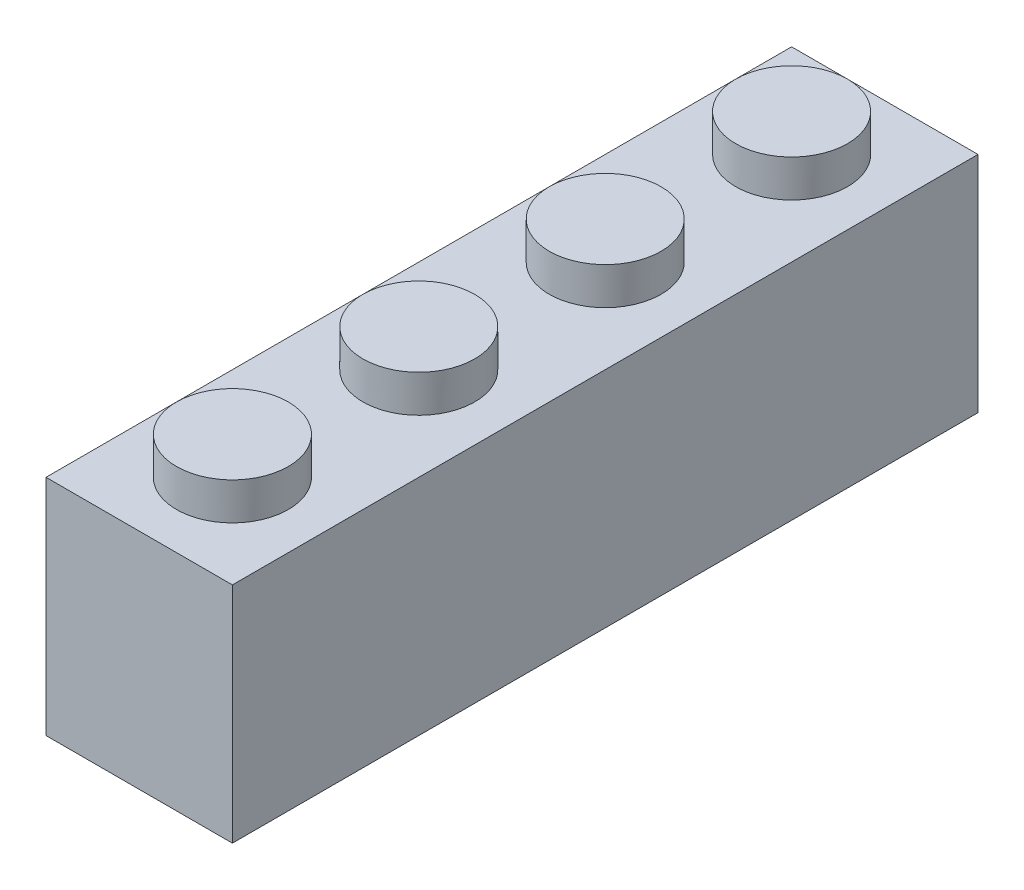
ISO-10303-21;
HEADER;
FILE_DESCRIPTION(('STEP AP214'),'2;1');
FILE_NAME('part.step','',(''),(''),'','','');
FILE_SCHEMA(('AUTOMOTIVE_DESIGN { 1 0 10303 214 1 1 1 1 }'));
ENDSEC;
DATA;
#1=APPLICATION_CONTEXT('core data for automotive mechanical design processes');
#2=APPLICATION_PROTOCOL_DEFINITION('international standard','automotive_design',2000,#1);
#3=PRODUCT_CONTEXT('',#1,'mechanical');
#4=PRODUCT('Part','Part','',(#3));
#5=PRODUCT_RELATED_PRODUCT_CATEGORY('part','',(#4));
#6=PRODUCT_DEFINITION_FORMATION('','',#4);
#7=PRODUCT_DEFINITION_CONTEXT('part definition',#1,'design');
#8=PRODUCT_DEFINITION('design','',#6,#7);
#9=PRODUCT_DEFINITION_SHAPE('','',#8);
#10=(LENGTH_UNIT() NAMED_UNIT(*) SI_UNIT(.MILLI.,.METRE.));
#11=(NAMED_UNIT(*) PLANE_ANGLE_UNIT() SI_UNIT($,.RADIAN.));
#12=(NAMED_UNIT(*) SI_UNIT($,.STERADIAN.) SOLID_ANGLE_UNIT());
#13=UNCERTAINTY_MEASURE_WITH_UNIT(LENGTH_MEASURE(1.E-05),#10,'distance_accuracy_value','');
#14=(GEOMETRIC_REPRESENTATION_CONTEXT(3) GLOBAL_UNCERTAINTY_ASSIGNED_CONTEXT((#13)) GLOBAL_UNIT_ASSIGNED_CONTEXT((#10,
#11,#12)) REPRESENTATION_CONTEXT('',''));
#15=CARTESIAN_POINT('',(0.,0.,0.));
#16=DIRECTION('',(0.,0.,1.));
#17=DIRECTION('',(1.,0.,0.));
#18=AXIS2_PLACEMENT_3D('',#15,#16,#17);
#19=CARTESIAN_POINT('',(0.,0.,0.));
#20=DIRECTION('',(0.,-1.,0.));
#21=DIRECTION('',(0.,0.,-1.));
#22=AXIS2_PLACEMENT_3D('',#19,#20,#21);
#23=PLANE('',#22);
#24=DIRECTION('',(0.,0.,1.));
#25=VECTOR('',#24,1.);
#26=CARTESIAN_POINT('',(0.,0.,0.));
#27=LINE('',#26,#25);
#28=CARTESIAN_POINT('',(0.,0.,-32.));
#29=VERTEX_POINT('',#28);
#30=CARTESIAN_POINT('',(0.,0.,0.));
#31=VERTEX_POINT('',#30);
#32=EDGE_CURVE('E172',#29,#31,#27,.T.);
#33=ORIENTED_EDGE('',*,*,#32,.F.);
#34=DIRECTION('',(-1.,0.,0.));
#35=VECTOR('',#34,1.);
#36=CARTESIAN_POINT('',(0.,0.,-32.));
#37=LINE('',#36,#35);
#38=CARTESIAN_POINT('',(8.,0.,-32.));
#39=VERTEX_POINT('',#38);
#40=EDGE_CURVE('E82',#39,#29,#37,.T.);
#41=ORIENTED_EDGE('',*,*,#40,.F.);
#42=DIRECTION('',(0.,0.,-1.));
#43=VECTOR('',#42,1.);
#44=CARTESIAN_POINT('',(8.,0.,0.));
#45=LINE('',#44,#43);
#46=CARTESIAN_POINT('',(8.,0.,0.));
#47=VERTEX_POINT('',#46);
#48=EDGE_CURVE('E184',#47,#39,#45,.T.);
#49=ORIENTED_EDGE('',*,*,#48,.F.);
#50=DIRECTION('',(1.,0.,0.));
#51=VECTOR('',#50,1.);
#52=CARTESIAN_POINT('',(0.,0.,0.));
#53=LINE('',#52,#51);
#54=EDGE_CURVE('E182',#31,#47,#53,.T.);
#55=ORIENTED_EDGE('',*,*,#54,.F.);
#56=EDGE_LOOP('',(#33,#41,#49,#55));
#57=FACE_BOUND('',#56,.T.);
#58=DIRECTION('',(-1.,0.,0.));
#59=VECTOR('',#58,1.);
#60=CARTESIAN_POINT('',(0.,0.,-30.4));
#61=LINE('',#60,#59);
#62=CARTESIAN_POINT('',(6.4,0.,-30.4));
#63=VERTEX_POINT('',#62);
#64=CARTESIAN_POINT('',(1.6,0.,-30.4));
#65=VERTEX_POINT('',#64);
#66=EDGE_CURVE('E160',#63,#65,#61,.T.);
#67=ORIENTED_EDGE('',*,*,#66,.T.);
#68=DIRECTION('',(0.,0.,1.));
#69=VECTOR('',#68,1.);
#70=CARTESIAN_POINT('',(1.6,0.,0.));
#71=LINE('',#70,#69);
#72=CARTESIAN_POINT('',(1.6,0.,-1.6));
#73=VERTEX_POINT('',#72);
#74=EDGE_CURVE('E153',#65,#73,#71,.T.);
#75=ORIENTED_EDGE('',*,*,#74,.T.);
#76=DIRECTION('',(1.,0.,0.));
#77=VECTOR('',#76,1.);
#78=CARTESIAN_POINT('',(0.,0.,-1.6));
#79=LINE('',#78,#77);
#80=CARTESIAN_POINT('',(6.4,0.,-1.6));
#81=VERTEX_POINT('',#80);
#82=EDGE_CURVE('E159',#73,#81,#79,.T.);
#83=ORIENTED_EDGE('',*,*,#82,.T.);
#84=DIRECTION('',(0.,0.,-1.));
#85=VECTOR('',#84,1.);
#86=CARTESIAN_POINT('',(6.4,0.,0.));
#87=LINE('',#86,#85);
#88=EDGE_CURVE('E52',#81,#63,#87,.T.);
#89=ORIENTED_EDGE('',*,*,#88,.T.);
#90=EDGE_LOOP('',(#67,#75,#83,#89));
#91=FACE_BOUND('',#90,.T.);
#92=ADVANCED_FACE('F37',(#57,#91),#23,.T.);
#93=CARTESIAN_POINT('',(4.,11.2,-28.));
#94=DIRECTION('',(0.,1.,0.));
#95=DIRECTION('',(0.,0.,1.));
#96=AXIS2_PLACEMENT_3D('',#93,#94,#95);
#97=PLANE('',#96);
#98=CARTESIAN_POINT('',(4.,11.2,-28.));
#99=DIRECTION('',(0.,1.,0.));
#100=DIRECTION('',(0.,0.,1.));
#101=AXIS2_PLACEMENT_3D('',#98,#99,#100);
#102=CIRCLE('',#101,2.4);
#103=CARTESIAN_POINT('',(4.,11.2,-25.6));
#104=VERTEX_POINT('',#103);
#105=EDGE_CURVE('E11',#104,#104,#102,.T.);
#106=ORIENTED_EDGE('',*,*,#105,.T.);
#107=EDGE_LOOP('',(#106));
#108=FACE_BOUND('',#107,.T.);
#109=ADVANCED_FACE('F39',(#108),#97,.T.);
#110=CARTESIAN_POINT('',(4.,11.2,-28.));
#111=DIRECTION('',(0.,-1.,0.));
#112=DIRECTION('',(0.,0.,-1.));
#113=AXIS2_PLACEMENT_3D('',#110,#111,#112);
#114=CYLINDRICAL_SURFACE('',#113,2.4);
#115=ORIENTED_EDGE('',*,*,#105,.F.);
#116=EDGE_LOOP('',(#115));
#117=FACE_BOUND('',#116,.T.);
#118=CARTESIAN_POINT('',(4.,9.6,-28.));
#119=DIRECTION('',(0.,-1.,0.));
#120=DIRECTION('',(0.,0.,-1.));
#121=AXIS2_PLACEMENT_3D('',#118,#119,#120);
#122=CIRCLE('',#121,2.4);
#123=CARTESIAN_POINT('',(4.,9.6,-30.4));
#124=VERTEX_POINT('',#123);
#125=EDGE_CURVE('E45',#124,#124,#122,.F.);
#126=ORIENTED_EDGE('',*,*,#125,.T.);
#127=EDGE_LOOP('',(#126));
#128=FACE_BOUND('',#127,.T.);
#129=ADVANCED_FACE('F209',(#117,#128),#114,.T.);
#130=CARTESIAN_POINT('',(4.,11.2,-20.));
#131=DIRECTION('',(0.,1.,0.));
#132=DIRECTION('',(0.,0.,1.));
#133=AXIS2_PLACEMENT_3D('',#130,#131,#132);
#134=PLANE('',#133);
#135=CARTESIAN_POINT('',(4.,11.2,-20.));
#136=DIRECTION('',(0.,1.,0.));
#137=DIRECTION('',(0.,0.,1.));
#138=AXIS2_PLACEMENT_3D('',#135,#136,#137);
#139=CIRCLE('',#138,2.4);
#140=CARTESIAN_POINT('',(4.,11.2,-17.6));
#141=VERTEX_POINT('',#140);
#142=EDGE_CURVE('E204',#141,#141,#139,.T.);
#143=ORIENTED_EDGE('',*,*,#142,.T.);
#144=EDGE_LOOP('',(#143));
#145=FACE_BOUND('',#144,.T.);
#146=ADVANCED_FACE('F251',(#145),#134,.T.);
#147=CARTESIAN_POINT('',(4.,11.2,-20.));
#148=DIRECTION('',(0.,-1.,0.));
#149=DIRECTION('',(0.,0.,-1.));
#150=AXIS2_PLACEMENT_3D('',#147,#148,#149);
#151=CYLINDRICAL_SURFACE('',#150,2.4);
#152=ORIENTED_EDGE('',*,*,#142,.F.);
#153=EDGE_LOOP('',(#152));
#154=FACE_BOUND('',#153,.T.);
#155=CARTESIAN_POINT('',(4.,9.6,-20.));
#156=DIRECTION('',(0.,-1.,0.));
#157=DIRECTION('',(0.,0.,-1.));
#158=AXIS2_PLACEMENT_3D('',#155,#156,#157);
#159=CIRCLE('',#158,2.4);
#160=CARTESIAN_POINT('',(4.,9.6,-22.4));
#161=VERTEX_POINT('',#160);
#162=EDGE_CURVE('E201',#161,#161,#159,.F.);
#163=ORIENTED_EDGE('',*,*,#162,.T.);
#164=EDGE_LOOP('',(#163));
#165=FACE_BOUND('',#164,.T.);
#166=ADVANCED_FACE('F247',(#154,#165),#151,.T.);
#167=CARTESIAN_POINT('',(0.,9.6,0.));
#168=DIRECTION('',(1.,0.,0.));
#169=DIRECTION('',(0.,0.,-1.));
#170=AXIS2_PLACEMENT_3D('',#167,#168,#169);
#171=PLANE('',#170);
#172=ORIENTED_EDGE('',*,*,#32,.T.);
#173=DIRECTION('',(0.,-1.,0.));
#174=VECTOR('',#173,1.);
#175=CARTESIAN_POINT('',(0.,9.6,0.));
#176=LINE('',#175,#174);
#177=CARTESIAN_POINT('',(0.,9.6,0.));
#178=VERTEX_POINT('',#177);
#179=EDGE_CURVE('E193',#178,#31,#176,.T.);
#180=ORIENTED_EDGE('',*,*,#179,.F.);
#181=DIRECTION('',(0.,0.,1.));
#182=VECTOR('',#181,1.);
#183=CARTESIAN_POINT('',(0.,9.6,0.));
#184=LINE('',#183,#182);
#185=CARTESIAN_POINT('',(0.,9.6,-32.));
#186=VERTEX_POINT('',#185);
#187=EDGE_CURVE('E173',#186,#178,#184,.T.);
#188=ORIENTED_EDGE('',*,*,#187,.F.);
#189=DIRECTION('',(0.,-1.,0.));
#190=VECTOR('',#189,1.);
#191=CARTESIAN_POINT('',(0.,9.6,-32.));
#192=LINE('',#191,#190);
#193=EDGE_CURVE('E179',#186,#29,#192,.T.);
#194=ORIENTED_EDGE('',*,*,#193,.T.);
#195=EDGE_LOOP('',(#172,#180,#188,#194));
#196=FACE_BOUND('',#195,.T.);
#197=ADVANCED_FACE('F244',(#196),#171,.F.);
#198=CARTESIAN_POINT('',(0.,9.6,0.));
#199=DIRECTION('',(0.,0.,-1.));
#200=DIRECTION('',(-1.,0.,0.));
#201=AXIS2_PLACEMENT_3D('',#198,#199,#200);
#202=PLANE('',#201);
#203=ORIENTED_EDGE('',*,*,#54,.T.);
#204=DIRECTION('',(0.,-1.,0.));
#205=VECTOR('',#204,1.);
#206=CARTESIAN_POINT('',(8.,9.6,0.));
#207=LINE('',#206,#205);
#208=CARTESIAN_POINT('',(8.,9.6,0.));
#209=VERTEX_POINT('',#208);
#210=EDGE_CURVE('E190',#209,#47,#207,.T.);
#211=ORIENTED_EDGE('',*,*,#210,.F.);
#212=DIRECTION('',(1.,0.,0.));
#213=VECTOR('',#212,1.);
#214=CARTESIAN_POINT('',(0.,9.6,0.));
#215=LINE('',#214,#213);
#216=EDGE_CURVE('E90',#178,#209,#215,.T.);
#217=ORIENTED_EDGE('',*,*,#216,.F.);
#218=ORIENTED_EDGE('',*,*,#179,.T.);
#219=EDGE_LOOP('',(#203,#211,#217,#218));
#220=FACE_BOUND('',#219,.T.);
#221=ADVANCED_FACE('F240',(#220),#202,.F.);
#222=CARTESIAN_POINT('',(8.,9.6,0.));
#223=DIRECTION('',(-1.,0.,0.));
#224=DIRECTION('',(0.,0.,1.));
#225=AXIS2_PLACEMENT_3D('',#222,#223,#224);
#226=PLANE('',#225);
#227=ORIENTED_EDGE('',*,*,#48,.T.);
#228=DIRECTION('',(0.,-1.,0.));
#229=VECTOR('',#228,1.);
#230=CARTESIAN_POINT('',(8.,9.6,-32.));
#231=LINE('',#230,#229);
#232=CARTESIAN_POINT('',(8.,9.6,-32.));
#233=VERTEX_POINT('',#232);
#234=EDGE_CURVE('E188',#233,#39,#231,.T.);
#235=ORIENTED_EDGE('',*,*,#234,.F.);
#236=DIRECTION('',(0.,0.,-1.));
#237=VECTOR('',#236,1.);
#238=CARTESIAN_POINT('',(8.,9.6,0.));
#239=LINE('',#238,#237);
#240=EDGE_CURVE('E176',#209,#233,#239,.T.);
#241=ORIENTED_EDGE('',*,*,#240,.F.);
#242=ORIENTED_EDGE('',*,*,#210,.T.);
#243=EDGE_LOOP('',(#227,#235,#241,#242));
#244=FACE_BOUND('',#243,.T.);
#245=ADVANCED_FACE('F224',(#244),#226,.F.);
#246=CARTESIAN_POINT('',(0.,9.6,-32.));
#247=DIRECTION('',(0.,0.,1.));
#248=DIRECTION('',(1.,0.,0.));
#249=AXIS2_PLACEMENT_3D('',#246,#247,#248);
#250=PLANE('',#249);
#251=ORIENTED_EDGE('',*,*,#40,.T.);
#252=ORIENTED_EDGE('',*,*,#193,.F.);
#253=DIRECTION('',(-1.,0.,0.));
#254=VECTOR('',#253,1.);
#255=CARTESIAN_POINT('',(0.,9.6,-32.));
#256=LINE('',#255,#254);
#257=EDGE_CURVE('E61',#233,#186,#256,.T.);
#258=ORIENTED_EDGE('',*,*,#257,.F.);
#259=ORIENTED_EDGE('',*,*,#234,.T.);
#260=EDGE_LOOP('',(#251,#252,#258,#259));
#261=FACE_BOUND('',#260,.T.);
#262=ADVANCED_FACE('F214',(#261),#250,.F.);
#263=CARTESIAN_POINT('',(0.,9.6,0.));
#264=DIRECTION('',(0.,-1.,0.));
#265=DIRECTION('',(0.,0.,-1.));
#266=AXIS2_PLACEMENT_3D('',#263,#264,#265);
#267=PLANE('',#266);
#268=CARTESIAN_POINT('',(4.,9.6,-12.));
#269=DIRECTION('',(0.,-1.,0.));
#270=DIRECTION('',(0.,0.,-1.));
#271=AXIS2_PLACEMENT_3D('',#268,#269,#270);
#272=CIRCLE('',#271,2.4);
#273=CARTESIAN_POINT('',(4.,9.6,-14.4));
#274=VERTEX_POINT('',#273);
#275=EDGE_CURVE('E198',#274,#274,#272,.F.);
#276=ORIENTED_EDGE('',*,*,#275,.F.);
#277=EDGE_LOOP('',(#276));
#278=FACE_BOUND('',#277,.T.);
#279=CARTESIAN_POINT('',(4.,9.6,-4.));
#280=DIRECTION('',(0.,-1.,0.));
#281=DIRECTION('',(0.,0.,-1.));
#282=AXIS2_PLACEMENT_3D('',#279,#280,#281);
#283=CIRCLE('',#282,2.4);
#284=CARTESIAN_POINT('',(4.,9.6,-6.4));
#285=VERTEX_POINT('',#284);
#286=EDGE_CURVE('E195',#285,#285,#283,.F.);
#287=ORIENTED_EDGE('',*,*,#286,.F.);
#288=EDGE_LOOP('',(#287));
#289=FACE_BOUND('',#288,.T.);
#290=ORIENTED_EDGE('',*,*,#187,.T.);
#291=ORIENTED_EDGE('',*,*,#216,.T.);
#292=ORIENTED_EDGE('',*,*,#240,.T.);
#293=ORIENTED_EDGE('',*,*,#257,.T.);
#294=EDGE_LOOP('',(#290,#291,#292,#293));
#295=FACE_BOUND('',#294,.T.);
#296=ORIENTED_EDGE('',*,*,#162,.F.);
#297=EDGE_LOOP('',(#296));
#298=FACE_BOUND('',#297,.T.);
#299=ORIENTED_EDGE('',*,*,#125,.F.);
#300=EDGE_LOOP('',(#299));
#301=FACE_BOUND('',#300,.T.);
#302=ADVANCED_FACE('F211',(#278,#289,#295,#298,#301),#267,.F.);
#303=CARTESIAN_POINT('',(4.,11.2,-4.));
#304=DIRECTION('',(0.,-1.,0.));
#305=DIRECTION('',(0.,0.,-1.));
#306=AXIS2_PLACEMENT_3D('',#303,#304,#305);
#307=CYLINDRICAL_SURFACE('',#306,2.4);
#308=CARTESIAN_POINT('',(4.,11.2,-4.));
#309=DIRECTION('',(0.,1.,0.));
#310=DIRECTION('',(0.,0.,1.));
#311=AXIS2_PLACEMENT_3D('',#308,#309,#310);
#312=CIRCLE('',#311,2.4);
#313=CARTESIAN_POINT('',(4.,11.2,-1.6));
#314=VERTEX_POINT('',#313);
#315=EDGE_CURVE('E168',#314,#314,#312,.T.);
#316=ORIENTED_EDGE('',*,*,#315,.F.);
#317=EDGE_LOOP('',(#316));
#318=FACE_BOUND('',#317,.T.);
#319=ORIENTED_EDGE('',*,*,#286,.T.);
#320=EDGE_LOOP('',(#319));
#321=FACE_BOUND('',#320,.T.);
#322=ADVANCED_FACE('F213',(#318,#321),#307,.T.);
#323=CARTESIAN_POINT('',(4.,11.2,-4.));
#324=DIRECTION('',(0.,1.,0.));
#325=DIRECTION('',(0.,0.,1.));
#326=AXIS2_PLACEMENT_3D('',#323,#324,#325);
#327=PLANE('',#326);
#328=ORIENTED_EDGE('',*,*,#315,.T.);
#329=EDGE_LOOP('',(#328));
#330=FACE_BOUND('',#329,.T.);
#331=ADVANCED_FACE('F221',(#330),#327,.T.);
#332=CARTESIAN_POINT('',(4.,11.2,-12.));
#333=DIRECTION('',(0.,-1.,0.));
#334=DIRECTION('',(0.,0.,-1.));
#335=AXIS2_PLACEMENT_3D('',#332,#333,#334);
#336=CYLINDRICAL_SURFACE('',#335,2.4);
#337=CARTESIAN_POINT('',(4.,11.2,-12.));
#338=DIRECTION('',(0.,1.,0.));
#339=DIRECTION('',(0.,0.,1.));
#340=AXIS2_PLACEMENT_3D('',#337,#338,#339);
#341=CIRCLE('',#340,2.4);
#342=CARTESIAN_POINT('',(4.,11.2,-9.6));
#343=VERTEX_POINT('',#342);
#344=EDGE_CURVE('E165',#343,#343,#341,.T.);
#345=ORIENTED_EDGE('',*,*,#344,.F.);
#346=EDGE_LOOP('',(#345));
#347=FACE_BOUND('',#346,.T.);
#348=ORIENTED_EDGE('',*,*,#275,.T.);
#349=EDGE_LOOP('',(#348));
#350=FACE_BOUND('',#349,.T.);
#351=ADVANCED_FACE('F301',(#347,#350),#336,.T.);
#352=CARTESIAN_POINT('',(4.,11.2,-12.));
#353=DIRECTION('',(0.,1.,0.));
#354=DIRECTION('',(0.,0.,1.));
#355=AXIS2_PLACEMENT_3D('',#352,#353,#354);
#356=PLANE('',#355);
#357=ORIENTED_EDGE('',*,*,#344,.T.);
#358=EDGE_LOOP('',(#357));
#359=FACE_BOUND('',#358,.T.);
#360=ADVANCED_FACE('F323',(#359),#356,.T.);
#361=CARTESIAN_POINT('',(4.,9.6,-28.));
#362=DIRECTION('',(0.,1.,0.));
#363=DIRECTION('',(0.,0.,1.));
#364=AXIS2_PLACEMENT_3D('',#361,#362,#363);
#365=PLANE('',#364);
#366=CARTESIAN_POINT('',(4.,9.6,-28.));
#367=DIRECTION('',(0.,1.,0.));
#368=DIRECTION('',(0.,0.,1.));
#369=AXIS2_PLACEMENT_3D('',#366,#367,#368);
#370=CIRCLE('',#369,0.799999999999999);
#371=CARTESIAN_POINT('',(4.,9.6,-27.2));
#372=VERTEX_POINT('',#371);
#373=EDGE_CURVE('E169',#372,#372,#370,.T.);
#374=ORIENTED_EDGE('',*,*,#373,.F.);
#375=EDGE_LOOP('',(#374));
#376=FACE_BOUND('',#375,.T.);
#377=ADVANCED_FACE('F332',(#376),#365,.F.);
#378=CARTESIAN_POINT('',(4.,11.2,-28.));
#379=DIRECTION('',(0.,-1.,0.));
#380=DIRECTION('',(0.,0.,-1.));
#381=AXIS2_PLACEMENT_3D('',#378,#379,#380);
#382=CYLINDRICAL_SURFACE('',#381,0.799999999999999);
#383=ORIENTED_EDGE('',*,*,#373,.T.);
#384=EDGE_LOOP('',(#383));
#385=FACE_BOUND('',#384,.T.);
#386=CARTESIAN_POINT('',(4.,8.,-28.));
#387=DIRECTION('',(0.,-1.,0.));
#388=DIRECTION('',(0.,0.,-1.));
#389=AXIS2_PLACEMENT_3D('',#386,#387,#388);
#390=CIRCLE('',#389,0.799999999999999);
#391=CARTESIAN_POINT('',(4.,8.,-28.8));
#392=VERTEX_POINT('',#391);
#393=EDGE_CURVE('E145',#392,#392,#390,.F.);
#394=ORIENTED_EDGE('',*,*,#393,.F.);
#395=EDGE_LOOP('',(#394));
#396=FACE_BOUND('',#395,.T.);
#397=ADVANCED_FACE('F345',(#385,#396),#382,.F.);
#398=CARTESIAN_POINT('',(4.,9.6,-20.));
#399=DIRECTION('',(0.,1.,0.));
#400=DIRECTION('',(0.,0.,1.));
#401=AXIS2_PLACEMENT_3D('',#398,#399,#400);
#402=PLANE('',#401);
#403=CARTESIAN_POINT('',(4.,9.6,-20.));
#404=DIRECTION('',(0.,1.,0.));
#405=DIRECTION('',(0.,0.,1.));
#406=AXIS2_PLACEMENT_3D('',#403,#404,#405);
#407=CIRCLE('',#406,0.799999999999999);
#408=CARTESIAN_POINT('',(4.,9.6,-19.2));
#409=VERTEX_POINT('',#408);
#410=EDGE_CURVE('E141',#409,#409,#407,.T.);
#411=ORIENTED_EDGE('',*,*,#410,.F.);
#412=EDGE_LOOP('',(#411));
#413=FACE_BOUND('',#412,.T.);
#414=ADVANCED_FACE('F354',(#413),#402,.F.);
#415=CARTESIAN_POINT('',(4.,11.2,-20.));
#416=DIRECTION('',(0.,-1.,0.));
#417=DIRECTION('',(0.,0.,-1.));
#418=AXIS2_PLACEMENT_3D('',#415,#416,#417);
#419=CYLINDRICAL_SURFACE('',#418,0.799999999999999);
#420=ORIENTED_EDGE('',*,*,#410,.T.);
#421=EDGE_LOOP('',(#420));
#422=FACE_BOUND('',#421,.T.);
#423=CARTESIAN_POINT('',(4.,8.,-20.));
#424=DIRECTION('',(0.,-1.,0.));
#425=DIRECTION('',(0.,0.,-1.));
#426=AXIS2_PLACEMENT_3D('',#423,#424,#425);
#427=CIRCLE('',#426,0.799999999999999);
#428=CARTESIAN_POINT('',(4.,8.,-20.8));
#429=VERTEX_POINT('',#428);
#430=EDGE_CURVE('E138',#429,#429,#427,.F.);
#431=ORIENTED_EDGE('',*,*,#430,.F.);
#432=EDGE_LOOP('',(#431));
#433=FACE_BOUND('',#432,.T.);
#434=ADVANCED_FACE('F363',(#422,#433),#419,.F.);
#435=CARTESIAN_POINT('',(1.6,9.6,0.));
#436=DIRECTION('',(1.,0.,0.));
#437=DIRECTION('',(0.,0.,-1.));
#438=AXIS2_PLACEMENT_3D('',#435,#436,#437);
#439=PLANE('',#438);
#440=ORIENTED_EDGE('',*,*,#74,.F.);
#441=DIRECTION('',(0.,-1.,0.));
#442=VECTOR('',#441,1.);
#443=CARTESIAN_POINT('',(1.6,9.6,-30.4));
#444=LINE('',#443,#442);
#445=CARTESIAN_POINT('',(1.6,8.,-30.4));
#446=VERTEX_POINT('',#445);
#447=EDGE_CURVE('E134',#446,#65,#444,.T.);
#448=ORIENTED_EDGE('',*,*,#447,.F.);
#449=DIRECTION('',(0.,0.,1.));
#450=VECTOR('',#449,1.);
#451=CARTESIAN_POINT('',(1.6,8.,0.));
#452=LINE('',#451,#450);
#453=CARTESIAN_POINT('',(1.6,8.,-1.6));
#454=VERTEX_POINT('',#453);
#455=EDGE_CURVE('E123',#446,#454,#452,.T.);
#456=ORIENTED_EDGE('',*,*,#455,.T.);
#457=DIRECTION('',(0.,-1.,0.));
#458=VECTOR('',#457,1.);
#459=CARTESIAN_POINT('',(1.6,9.6,-1.6));
#460=LINE('',#459,#458);
#461=EDGE_CURVE('E117',#454,#73,#460,.T.);
#462=ORIENTED_EDGE('',*,*,#461,.T.);
#463=EDGE_LOOP('',(#440,#448,#456,#462));
#464=FACE_BOUND('',#463,.T.);
#465=ADVANCED_FACE('F372',(#464),#439,.T.);
#466=CARTESIAN_POINT('',(0.,9.6,-1.6));
#467=DIRECTION('',(0.,0.,-1.));
#468=DIRECTION('',(-1.,0.,0.));
#469=AXIS2_PLACEMENT_3D('',#466,#467,#468);
#470=PLANE('',#469);
#471=ORIENTED_EDGE('',*,*,#82,.F.);
#472=ORIENTED_EDGE('',*,*,#461,.F.);
#473=DIRECTION('',(1.,0.,0.));
#474=VECTOR('',#473,1.);
#475=CARTESIAN_POINT('',(0.,8.,-1.6));
#476=LINE('',#475,#474);
#477=CARTESIAN_POINT('',(6.4,8.,-1.6));
#478=VERTEX_POINT('',#477);
#479=EDGE_CURVE('E112',#454,#478,#476,.T.);
#480=ORIENTED_EDGE('',*,*,#479,.T.);
#481=DIRECTION('',(0.,-1.,0.));
#482=VECTOR('',#481,1.);
#483=CARTESIAN_POINT('',(6.4,9.6,-1.6));
#484=LINE('',#483,#482);
#485=EDGE_CURVE('E114',#478,#81,#484,.T.);
#486=ORIENTED_EDGE('',*,*,#485,.T.);
#487=EDGE_LOOP('',(#471,#472,#480,#486));
#488=FACE_BOUND('',#487,.T.);
#489=ADVANCED_FACE('F113',(#488),#470,.T.);
#490=CARTESIAN_POINT('',(6.4,9.6,0.));
#491=DIRECTION('',(-1.,0.,0.));
#492=DIRECTION('',(0.,0.,1.));
#493=AXIS2_PLACEMENT_3D('',#490,#491,#492);
#494=PLANE('',#493);
#495=ORIENTED_EDGE('',*,*,#88,.F.);
#496=ORIENTED_EDGE('',*,*,#485,.F.);
#497=DIRECTION('',(0.,0.,-1.));
#498=VECTOR('',#497,1.);
#499=CARTESIAN_POINT('',(6.4,8.,0.));
#500=LINE('',#499,#498);
#501=CARTESIAN_POINT('',(6.4,8.,-30.4));
#502=VERTEX_POINT('',#501);
#503=EDGE_CURVE('E122',#478,#502,#500,.T.);
#504=ORIENTED_EDGE('',*,*,#503,.T.);
#505=DIRECTION('',(0.,-1.,0.));
#506=VECTOR('',#505,1.);
#507=CARTESIAN_POINT('',(6.4,9.6,-30.4));
#508=LINE('',#507,#506);
#509=EDGE_CURVE('E127',#502,#63,#508,.T.);
#510=ORIENTED_EDGE('',*,*,#509,.T.);
#511=EDGE_LOOP('',(#495,#496,#504,#510));
#512=FACE_BOUND('',#511,.T.);
#513=ADVANCED_FACE('F125',(#512),#494,.T.);
#514=CARTESIAN_POINT('',(0.,9.6,-30.4));
#515=DIRECTION('',(0.,0.,1.));
#516=DIRECTION('',(1.,0.,0.));
#517=AXIS2_PLACEMENT_3D('',#514,#515,#516);
#518=PLANE('',#517);
#519=ORIENTED_EDGE('',*,*,#66,.F.);
#520=ORIENTED_EDGE('',*,*,#509,.F.);
#521=DIRECTION('',(-1.,0.,0.));
#522=VECTOR('',#521,1.);
#523=CARTESIAN_POINT('',(0.,8.,-30.4));
#524=LINE('',#523,#522);
#525=EDGE_CURVE('E132',#502,#446,#524,.T.);
#526=ORIENTED_EDGE('',*,*,#525,.T.);
#527=ORIENTED_EDGE('',*,*,#447,.T.);
#528=EDGE_LOOP('',(#519,#520,#526,#527));
#529=FACE_BOUND('',#528,.T.);
#530=ADVANCED_FACE('F396',(#529),#518,.T.);
#531=CARTESIAN_POINT('',(0.,8.,0.));
#532=DIRECTION('',(0.,-1.,0.));
#533=DIRECTION('',(0.,0.,-1.));
#534=AXIS2_PLACEMENT_3D('',#531,#532,#533);
#535=PLANE('',#534);
#536=CARTESIAN_POINT('',(4.,8.,-12.));
#537=DIRECTION('',(0.,-1.,0.));
#538=DIRECTION('',(0.,0.,-1.));
#539=AXIS2_PLACEMENT_3D('',#536,#537,#538);
#540=CIRCLE('',#539,0.799999999999999);
#541=CARTESIAN_POINT('',(4.,8.,-12.8));
#542=VERTEX_POINT('',#541);
#543=EDGE_CURVE('E142',#542,#542,#540,.F.);
#544=ORIENTED_EDGE('',*,*,#543,.T.);
#545=EDGE_LOOP('',(#544));
#546=FACE_BOUND('',#545,.T.);
#547=CARTESIAN_POINT('',(4.,8.,-4.));
#548=DIRECTION('',(0.,-1.,0.));
#549=DIRECTION('',(0.,0.,-1.));
#550=AXIS2_PLACEMENT_3D('',#547,#548,#549);
#551=CIRCLE('',#550,0.799999999999999);
#552=CARTESIAN_POINT('',(4.,8.,-4.8));
#553=VERTEX_POINT('',#552);
#554=EDGE_CURVE('E147',#553,#553,#551,.F.);
#555=ORIENTED_EDGE('',*,*,#554,.T.);
#556=EDGE_LOOP('',(#555));
#557=FACE_BOUND('',#556,.T.);
#558=ORIENTED_EDGE('',*,*,#455,.F.);
#559=ORIENTED_EDGE('',*,*,#525,.F.);
#560=ORIENTED_EDGE('',*,*,#503,.F.);
#561=ORIENTED_EDGE('',*,*,#479,.F.);
#562=EDGE_LOOP('',(#558,#559,#560,#561));
#563=FACE_BOUND('',#562,.T.);
#564=ORIENTED_EDGE('',*,*,#430,.T.);
#565=EDGE_LOOP('',(#564));
#566=FACE_BOUND('',#565,.T.);
#567=ORIENTED_EDGE('',*,*,#393,.T.);
#568=EDGE_LOOP('',(#567));
#569=FACE_BOUND('',#568,.T.);
#570=ADVANCED_FACE('F130',(#546,#557,#563,#566,#569),#535,.T.);
#571=CARTESIAN_POINT('',(4.,11.2,-4.));
#572=DIRECTION('',(0.,-1.,0.));
#573=DIRECTION('',(0.,0.,-1.));
#574=AXIS2_PLACEMENT_3D('',#571,#572,#573);
#575=CYLINDRICAL_SURFACE('',#574,0.799999999999999);
#576=CARTESIAN_POINT('',(4.,9.6,-4.));
#577=DIRECTION('',(0.,1.,0.));
#578=DIRECTION('',(0.,0.,1.));
#579=AXIS2_PLACEMENT_3D('',#576,#577,#578);
#580=CIRCLE('',#579,0.799999999999999);
#581=CARTESIAN_POINT('',(4.,9.6,-3.2));
#582=VERTEX_POINT('',#581);
#583=EDGE_CURVE('E150',#582,#582,#580,.T.);
#584=ORIENTED_EDGE('',*,*,#583,.T.);
#585=EDGE_LOOP('',(#584));
#586=FACE_BOUND('',#585,.T.);
#587=ORIENTED_EDGE('',*,*,#554,.F.);
#588=EDGE_LOOP('',(#587));
#589=FACE_BOUND('',#588,.T.);
#590=ADVANCED_FACE('F412',(#586,#589),#575,.F.);
#591=CARTESIAN_POINT('',(4.,9.6,-4.));
#592=DIRECTION('',(0.,1.,0.));
#593=DIRECTION('',(0.,0.,1.));
#594=AXIS2_PLACEMENT_3D('',#591,#592,#593);
#595=PLANE('',#594);
#596=ORIENTED_EDGE('',*,*,#583,.F.);
#597=EDGE_LOOP('',(#596));
#598=FACE_BOUND('',#597,.T.);
#599=ADVANCED_FACE('F421',(#598),#595,.F.);
#600=CARTESIAN_POINT('',(4.,11.2,-12.));
#601=DIRECTION('',(0.,-1.,0.));
#602=DIRECTION('',(0.,0.,-1.));
#603=AXIS2_PLACEMENT_3D('',#600,#601,#602);
#604=CYLINDRICAL_SURFACE('',#603,0.799999999999999);
#605=CARTESIAN_POINT('',(4.,9.6,-12.));
#606=DIRECTION('',(0.,1.,0.));
#607=DIRECTION('',(0.,0.,1.));
#608=AXIS2_PLACEMENT_3D('',#605,#606,#607);
#609=CIRCLE('',#608,0.799999999999999);
#610=CARTESIAN_POINT('',(4.,9.6,-11.2));
#611=VERTEX_POINT('',#610);
#612=EDGE_CURVE('E154',#611,#611,#609,.T.);
#613=ORIENTED_EDGE('',*,*,#612,.T.);
#614=EDGE_LOOP('',(#613));
#615=FACE_BOUND('',#614,.T.);
#616=ORIENTED_EDGE('',*,*,#543,.F.);
#617=EDGE_LOOP('',(#616));
#618=FACE_BOUND('',#617,.T.);
#619=ADVANCED_FACE('F430',(#615,#618),#604,.F.);
#620=CARTESIAN_POINT('',(4.,9.6,-12.));
#621=DIRECTION('',(0.,1.,0.));
#622=DIRECTION('',(0.,0.,1.));
#623=AXIS2_PLACEMENT_3D('',#620,#621,#622);
#624=PLANE('',#623);
#625=ORIENTED_EDGE('',*,*,#612,.F.);
#626=EDGE_LOOP('',(#625));
#627=FACE_BOUND('',#626,.T.);
#628=ADVANCED_FACE('F439',(#627),#624,.F.);
#629=CLOSED_SHELL('',(#92,#109,#129,#146,#166,#197,#221,#245,#262,#302,#322,#331,#351,#360,#377,
#397,#414,#434,#465,#489,#513,#530,#570,#590,#599,#619,#628));
#630=MANIFOLD_SOLID_BREP('B2',#629);
#631=ADVANCED_BREP_SHAPE_REPRESENTATION('',(#18,#630),#14);
#632=SHAPE_DEFINITION_REPRESENTATION(#9,#631);
ENDSEC;
END-ISO-10303-21;
